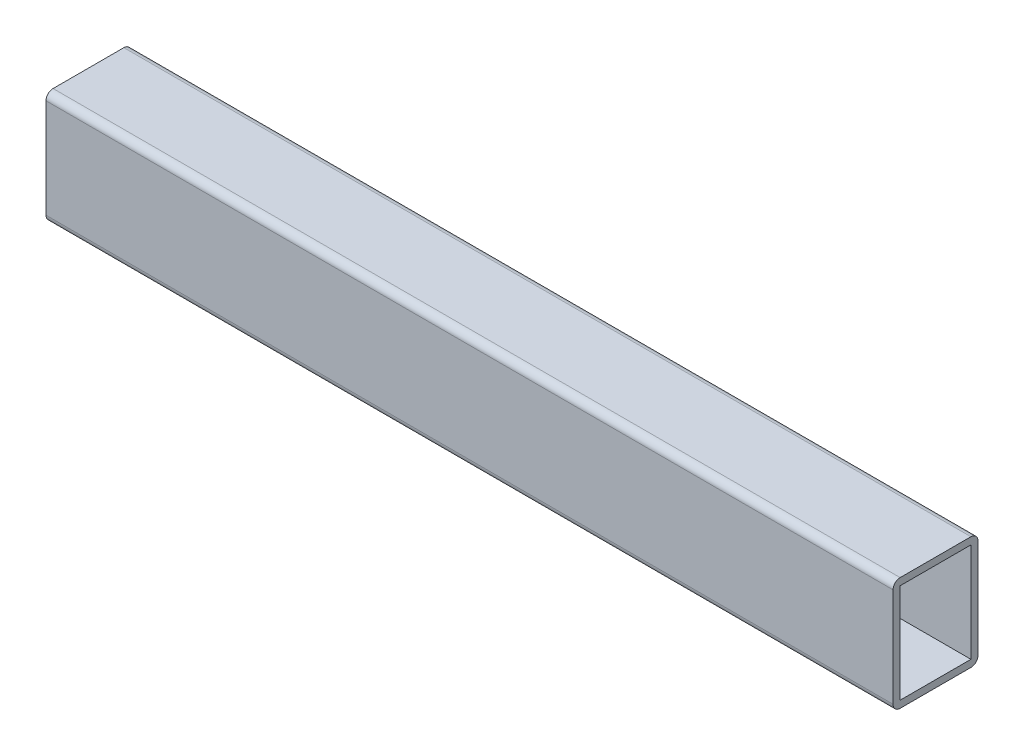
ISO-10303-21;
HEADER;
FILE_DESCRIPTION(('STEP AP214'),'2;1');
FILE_NAME('part.step','',(''),(''),'','','');
FILE_SCHEMA(('AUTOMOTIVE_DESIGN { 1 0 10303 214 1 1 1 1 }'));
ENDSEC;
DATA;
#1=APPLICATION_CONTEXT('core data for automotive mechanical design processes');
#2=APPLICATION_PROTOCOL_DEFINITION('international standard','automotive_design',2000,#1);
#3=PRODUCT_CONTEXT('',#1,'mechanical');
#4=PRODUCT('Part','Part','',(#3));
#5=PRODUCT_RELATED_PRODUCT_CATEGORY('part','',(#4));
#6=PRODUCT_DEFINITION_FORMATION('','',#4);
#7=PRODUCT_DEFINITION_CONTEXT('part definition',#1,'design');
#8=PRODUCT_DEFINITION('design','',#6,#7);
#9=PRODUCT_DEFINITION_SHAPE('','',#8);
#10=(LENGTH_UNIT() NAMED_UNIT(*) SI_UNIT(.MILLI.,.METRE.));
#11=(NAMED_UNIT(*) PLANE_ANGLE_UNIT() SI_UNIT($,.RADIAN.));
#12=(NAMED_UNIT(*) SI_UNIT($,.STERADIAN.) SOLID_ANGLE_UNIT());
#13=UNCERTAINTY_MEASURE_WITH_UNIT(LENGTH_MEASURE(1.E-05),#10,'distance_accuracy_value','');
#14=(GEOMETRIC_REPRESENTATION_CONTEXT(3) GLOBAL_UNCERTAINTY_ASSIGNED_CONTEXT((#13)) GLOBAL_UNIT_ASSIGNED_CONTEXT((#10,
#11,#12)) REPRESENTATION_CONTEXT('',''));
#15=CARTESIAN_POINT('',(0.,0.,0.));
#16=DIRECTION('',(0.,0.,1.));
#17=DIRECTION('',(1.,0.,0.));
#18=AXIS2_PLACEMENT_3D('',#15,#16,#17);
#19=CARTESIAN_POINT('',(380.,22.225,15.875));
#20=DIRECTION('',(1.,0.,0.));
#21=DIRECTION('',(0.,0.,-1.));
#22=AXIS2_PLACEMENT_3D('',#19,#20,#21);
#23=PLANE('',#22);
#24=CARTESIAN_POINT('',(380.,22.225,15.875));
#25=DIRECTION('',(1.,0.,0.));
#26=DIRECTION('',(0.,0.,-1.));
#27=AXIS2_PLACEMENT_3D('',#24,#25,#26);
#28=CIRCLE('',#27,3.175);
#29=CARTESIAN_POINT('',(380.,25.4,15.875));
#30=VERTEX_POINT('',#29);
#31=CARTESIAN_POINT('',(380.,22.225,19.05));
#32=VERTEX_POINT('',#31);
#33=EDGE_CURVE('E156',#30,#32,#28,.T.);
#34=ORIENTED_EDGE('',*,*,#33,.T.);
#35=DIRECTION('',(0.,-1.,0.));
#36=VECTOR('',#35,1.);
#37=CARTESIAN_POINT('',(380.,22.225,19.05));
#38=LINE('',#37,#36);
#39=CARTESIAN_POINT('',(380.,-22.225,19.05));
#40=VERTEX_POINT('',#39);
#41=EDGE_CURVE('E159',#32,#40,#38,.T.);
#42=ORIENTED_EDGE('',*,*,#41,.T.);
#43=CARTESIAN_POINT('',(380.,-22.225,15.875));
#44=DIRECTION('',(1.,0.,0.));
#45=DIRECTION('',(0.,0.,1.));
#46=AXIS2_PLACEMENT_3D('',#43,#44,#45);
#47=CIRCLE('',#46,3.175);
#48=CARTESIAN_POINT('',(380.,-25.4,15.875));
#49=VERTEX_POINT('',#48);
#50=EDGE_CURVE('E162',#40,#49,#47,.T.);
#51=ORIENTED_EDGE('',*,*,#50,.T.);
#52=DIRECTION('',(0.,0.,-1.));
#53=VECTOR('',#52,1.);
#54=CARTESIAN_POINT('',(380.,-25.4,15.875));
#55=LINE('',#54,#53);
#56=CARTESIAN_POINT('',(380.,-25.4,-15.875));
#57=VERTEX_POINT('',#56);
#58=EDGE_CURVE('E164',#49,#57,#55,.T.);
#59=ORIENTED_EDGE('',*,*,#58,.T.);
#60=CARTESIAN_POINT('',(380.,-22.225,-15.875));
#61=DIRECTION('',(1.,0.,0.));
#62=DIRECTION('',(0.,0.,-1.));
#63=AXIS2_PLACEMENT_3D('',#60,#61,#62);
#64=CIRCLE('',#63,3.175);
#65=CARTESIAN_POINT('',(380.,-22.225,-19.05));
#66=VERTEX_POINT('',#65);
#67=EDGE_CURVE('E166',#57,#66,#64,.T.);
#68=ORIENTED_EDGE('',*,*,#67,.T.);
#69=DIRECTION('',(0.,1.,0.));
#70=VECTOR('',#69,1.);
#71=CARTESIAN_POINT('',(380.,22.225,-19.05));
#72=LINE('',#71,#70);
#73=CARTESIAN_POINT('',(380.,22.225,-19.05));
#74=VERTEX_POINT('',#73);
#75=EDGE_CURVE('E168',#66,#74,#72,.T.);
#76=ORIENTED_EDGE('',*,*,#75,.T.);
#77=CARTESIAN_POINT('',(380.,22.225,-15.875));
#78=DIRECTION('',(1.,0.,0.));
#79=DIRECTION('',(0.,0.,-1.));
#80=AXIS2_PLACEMENT_3D('',#77,#78,#79);
#81=CIRCLE('',#80,3.175);
#82=CARTESIAN_POINT('',(380.,25.4,-15.875));
#83=VERTEX_POINT('',#82);
#84=EDGE_CURVE('E170',#74,#83,#81,.T.);
#85=ORIENTED_EDGE('',*,*,#84,.T.);
#86=DIRECTION('',(0.,0.,1.));
#87=VECTOR('',#86,1.);
#88=CARTESIAN_POINT('',(380.,25.4,15.875));
#89=LINE('',#88,#87);
#90=EDGE_CURVE('E172',#83,#30,#89,.T.);
#91=ORIENTED_EDGE('',*,*,#90,.T.);
#92=EDGE_LOOP('',(#34,#42,#51,#59,#68,#76,#85,#91));
#93=FACE_BOUND('',#92,.T.);
#94=DIRECTION('',(0.,0.,-1.));
#95=VECTOR('',#94,1.);
#96=CARTESIAN_POINT('',(380.,-22.225,15.875));
#97=LINE('',#96,#95);
#98=CARTESIAN_POINT('',(380.,-22.225,15.875));
#99=VERTEX_POINT('',#98);
#100=CARTESIAN_POINT('',(380.,-22.225,-15.875));
#101=VERTEX_POINT('',#100);
#102=EDGE_CURVE('E128',#99,#101,#97,.T.);
#103=ORIENTED_EDGE('',*,*,#102,.F.);
#104=DIRECTION('',(0.,-1.,0.));
#105=VECTOR('',#104,1.);
#106=CARTESIAN_POINT('',(380.,22.225,15.875));
#107=LINE('',#106,#105);
#108=CARTESIAN_POINT('',(380.,22.225,15.875));
#109=VERTEX_POINT('',#108);
#110=EDGE_CURVE('E120',#109,#99,#107,.T.);
#111=ORIENTED_EDGE('',*,*,#110,.F.);
#112=DIRECTION('',(0.,0.,1.));
#113=VECTOR('',#112,1.);
#114=CARTESIAN_POINT('',(380.,22.225,15.875));
#115=LINE('',#114,#113);
#116=CARTESIAN_POINT('',(380.,22.225,-15.875));
#117=VERTEX_POINT('',#116);
#118=EDGE_CURVE('E142',#117,#109,#115,.T.);
#119=ORIENTED_EDGE('',*,*,#118,.F.);
#120=DIRECTION('',(0.,1.,0.));
#121=VECTOR('',#120,1.);
#122=CARTESIAN_POINT('',(380.,22.225,-15.875));
#123=LINE('',#122,#121);
#124=EDGE_CURVE('E140',#101,#117,#123,.T.);
#125=ORIENTED_EDGE('',*,*,#124,.F.);
#126=EDGE_LOOP('',(#103,#111,#119,#125));
#127=FACE_BOUND('',#126,.T.);
#128=ADVANCED_FACE('F31',(#93,#127),#23,.T.);
#129=CARTESIAN_POINT('',(0.,22.225,15.875));
#130=DIRECTION('',(1.,0.,0.));
#131=DIRECTION('',(0.,0.,-1.));
#132=AXIS2_PLACEMENT_3D('',#129,#130,#131);
#133=PLANE('',#132);
#134=CARTESIAN_POINT('',(0.,22.225,15.875));
#135=DIRECTION('',(1.,0.,0.));
#136=DIRECTION('',(0.,0.,-1.));
#137=AXIS2_PLACEMENT_3D('',#134,#135,#136);
#138=CIRCLE('',#137,3.175);
#139=CARTESIAN_POINT('',(0.,25.4,15.875));
#140=VERTEX_POINT('',#139);
#141=CARTESIAN_POINT('',(0.,22.225,19.05));
#142=VERTEX_POINT('',#141);
#143=EDGE_CURVE('E136',#140,#142,#138,.T.);
#144=ORIENTED_EDGE('',*,*,#143,.F.);
#145=DIRECTION('',(0.,0.,1.));
#146=VECTOR('',#145,1.);
#147=CARTESIAN_POINT('',(0.,25.4,15.875));
#148=LINE('',#147,#146);
#149=CARTESIAN_POINT('',(0.,25.4,-15.875));
#150=VERTEX_POINT('',#149);
#151=EDGE_CURVE('E160',#150,#140,#148,.T.);
#152=ORIENTED_EDGE('',*,*,#151,.F.);
#153=CARTESIAN_POINT('',(0.,22.225,-15.875));
#154=DIRECTION('',(1.,0.,0.));
#155=DIRECTION('',(0.,0.,-1.));
#156=AXIS2_PLACEMENT_3D('',#153,#154,#155);
#157=CIRCLE('',#156,3.175);
#158=CARTESIAN_POINT('',(0.,22.225,-19.05));
#159=VERTEX_POINT('',#158);
#160=EDGE_CURVE('E187',#159,#150,#157,.T.);
#161=ORIENTED_EDGE('',*,*,#160,.F.);
#162=DIRECTION('',(0.,1.,0.));
#163=VECTOR('',#162,1.);
#164=CARTESIAN_POINT('',(0.,22.225,-19.05));
#165=LINE('',#164,#163);
#166=CARTESIAN_POINT('',(0.,-22.225,-19.05));
#167=VERTEX_POINT('',#166);
#168=EDGE_CURVE('E185',#167,#159,#165,.T.);
#169=ORIENTED_EDGE('',*,*,#168,.F.);
#170=CARTESIAN_POINT('',(0.,-22.225,-15.875));
#171=DIRECTION('',(1.,0.,0.));
#172=DIRECTION('',(0.,0.,-1.));
#173=AXIS2_PLACEMENT_3D('',#170,#171,#172);
#174=CIRCLE('',#173,3.175);
#175=CARTESIAN_POINT('',(0.,-25.4,-15.875));
#176=VERTEX_POINT('',#175);
#177=EDGE_CURVE('E183',#176,#167,#174,.T.);
#178=ORIENTED_EDGE('',*,*,#177,.F.);
#179=DIRECTION('',(0.,0.,-1.));
#180=VECTOR('',#179,1.);
#181=CARTESIAN_POINT('',(0.,-25.4,15.875));
#182=LINE('',#181,#180);
#183=CARTESIAN_POINT('',(0.,-25.4,15.875));
#184=VERTEX_POINT('',#183);
#185=EDGE_CURVE('E181',#184,#176,#182,.T.);
#186=ORIENTED_EDGE('',*,*,#185,.F.);
#187=CARTESIAN_POINT('',(0.,-22.225,15.875));
#188=DIRECTION('',(1.,0.,0.));
#189=DIRECTION('',(0.,0.,1.));
#190=AXIS2_PLACEMENT_3D('',#187,#188,#189);
#191=CIRCLE('',#190,3.175);
#192=CARTESIAN_POINT('',(0.,-22.225,19.05));
#193=VERTEX_POINT('',#192);
#194=EDGE_CURVE('E179',#193,#184,#191,.T.);
#195=ORIENTED_EDGE('',*,*,#194,.F.);
#196=DIRECTION('',(0.,-1.,0.));
#197=VECTOR('',#196,1.);
#198=CARTESIAN_POINT('',(0.,22.225,19.05));
#199=LINE('',#198,#197);
#200=EDGE_CURVE('E177',#142,#193,#199,.T.);
#201=ORIENTED_EDGE('',*,*,#200,.F.);
#202=EDGE_LOOP('',(#144,#152,#161,#169,#178,#186,#195,#201));
#203=FACE_BOUND('',#202,.T.);
#204=DIRECTION('',(0.,-1.,0.));
#205=VECTOR('',#204,1.);
#206=CARTESIAN_POINT('',(0.,22.225,15.875));
#207=LINE('',#206,#205);
#208=CARTESIAN_POINT('',(0.,22.225,15.875));
#209=VERTEX_POINT('',#208);
#210=CARTESIAN_POINT('',(0.,-22.225,15.875));
#211=VERTEX_POINT('',#210);
#212=EDGE_CURVE('E54',#209,#211,#207,.T.);
#213=ORIENTED_EDGE('',*,*,#212,.T.);
#214=DIRECTION('',(0.,0.,-1.));
#215=VECTOR('',#214,1.);
#216=CARTESIAN_POINT('',(0.,-22.225,15.875));
#217=LINE('',#216,#215);
#218=CARTESIAN_POINT('',(0.,-22.225,-15.875));
#219=VERTEX_POINT('',#218);
#220=EDGE_CURVE('E135',#211,#219,#217,.T.);
#221=ORIENTED_EDGE('',*,*,#220,.T.);
#222=DIRECTION('',(0.,1.,0.));
#223=VECTOR('',#222,1.);
#224=CARTESIAN_POINT('',(0.,22.225,-15.875));
#225=LINE('',#224,#223);
#226=CARTESIAN_POINT('',(0.,22.225,-15.875));
#227=VERTEX_POINT('',#226);
#228=EDGE_CURVE('E148',#219,#227,#225,.T.);
#229=ORIENTED_EDGE('',*,*,#228,.T.);
#230=DIRECTION('',(0.,0.,1.));
#231=VECTOR('',#230,1.);
#232=CARTESIAN_POINT('',(0.,22.225,15.875));
#233=LINE('',#232,#231);
#234=EDGE_CURVE('E129',#227,#209,#233,.T.);
#235=ORIENTED_EDGE('',*,*,#234,.T.);
#236=EDGE_LOOP('',(#213,#221,#229,#235));
#237=FACE_BOUND('',#236,.T.);
#238=ADVANCED_FACE('F217',(#203,#237),#133,.F.);
#239=CARTESIAN_POINT('',(380.,22.225,15.875));
#240=DIRECTION('',(-1.,0.,0.));
#241=DIRECTION('',(0.,0.,1.));
#242=AXIS2_PLACEMENT_3D('',#239,#240,#241);
#243=CYLINDRICAL_SURFACE('',#242,3.175);
#244=ORIENTED_EDGE('',*,*,#143,.T.);
#245=DIRECTION('',(-1.,0.,0.));
#246=VECTOR('',#245,1.);
#247=CARTESIAN_POINT('',(380.,22.225,19.05));
#248=LINE('',#247,#246);
#249=EDGE_CURVE('E11',#32,#142,#248,.T.);
#250=ORIENTED_EDGE('',*,*,#249,.F.);
#251=ORIENTED_EDGE('',*,*,#33,.F.);
#252=DIRECTION('',(-1.,0.,0.));
#253=VECTOR('',#252,1.);
#254=CARTESIAN_POINT('',(380.,25.4,15.875));
#255=LINE('',#254,#253);
#256=EDGE_CURVE('E174',#30,#140,#255,.T.);
#257=ORIENTED_EDGE('',*,*,#256,.T.);
#258=EDGE_LOOP('',(#244,#250,#251,#257));
#259=FACE_BOUND('',#258,.T.);
#260=ADVANCED_FACE('F33',(#259),#243,.T.);
#261=CARTESIAN_POINT('',(380.,22.225,19.05));
#262=DIRECTION('',(0.,0.,-1.));
#263=DIRECTION('',(-1.,0.,0.));
#264=AXIS2_PLACEMENT_3D('',#261,#262,#263);
#265=PLANE('',#264);
#266=ORIENTED_EDGE('',*,*,#200,.T.);
#267=DIRECTION('',(-1.,0.,0.));
#268=VECTOR('',#267,1.);
#269=CARTESIAN_POINT('',(380.,-22.225,19.05));
#270=LINE('',#269,#268);
#271=EDGE_CURVE('E39',#40,#193,#270,.T.);
#272=ORIENTED_EDGE('',*,*,#271,.F.);
#273=ORIENTED_EDGE('',*,*,#41,.F.);
#274=ORIENTED_EDGE('',*,*,#249,.T.);
#275=EDGE_LOOP('',(#266,#272,#273,#274));
#276=FACE_BOUND('',#275,.T.);
#277=ADVANCED_FACE('F234',(#276),#265,.F.);
#278=CARTESIAN_POINT('',(380.,-22.225,15.875));
#279=DIRECTION('',(-1.,0.,0.));
#280=DIRECTION('',(0.,0.,1.));
#281=AXIS2_PLACEMENT_3D('',#278,#279,#280);
#282=CYLINDRICAL_SURFACE('',#281,3.175);
#283=ORIENTED_EDGE('',*,*,#194,.T.);
#284=DIRECTION('',(-1.,0.,0.));
#285=VECTOR('',#284,1.);
#286=CARTESIAN_POINT('',(380.,-25.4,15.875));
#287=LINE('',#286,#285);
#288=EDGE_CURVE('E204',#49,#184,#287,.T.);
#289=ORIENTED_EDGE('',*,*,#288,.F.);
#290=ORIENTED_EDGE('',*,*,#50,.F.);
#291=ORIENTED_EDGE('',*,*,#271,.T.);
#292=EDGE_LOOP('',(#283,#289,#290,#291));
#293=FACE_BOUND('',#292,.T.);
#294=ADVANCED_FACE('F211',(#293),#282,.T.);
#295=CARTESIAN_POINT('',(380.,-25.4,15.875));
#296=DIRECTION('',(0.,1.,0.));
#297=DIRECTION('',(0.,0.,1.));
#298=AXIS2_PLACEMENT_3D('',#295,#296,#297);
#299=PLANE('',#298);
#300=ORIENTED_EDGE('',*,*,#185,.T.);
#301=DIRECTION('',(-1.,0.,0.));
#302=VECTOR('',#301,1.);
#303=CARTESIAN_POINT('',(380.,-25.4,-15.875));
#304=LINE('',#303,#302);
#305=EDGE_CURVE('E201',#57,#176,#304,.T.);
#306=ORIENTED_EDGE('',*,*,#305,.F.);
#307=ORIENTED_EDGE('',*,*,#58,.F.);
#308=ORIENTED_EDGE('',*,*,#288,.T.);
#309=EDGE_LOOP('',(#300,#306,#307,#308));
#310=FACE_BOUND('',#309,.T.);
#311=ADVANCED_FACE('F223',(#310),#299,.F.);
#312=CARTESIAN_POINT('',(380.,-22.225,-15.875));
#313=DIRECTION('',(-1.,0.,0.));
#314=DIRECTION('',(0.,0.,1.));
#315=AXIS2_PLACEMENT_3D('',#312,#313,#314);
#316=CYLINDRICAL_SURFACE('',#315,3.175);
#317=ORIENTED_EDGE('',*,*,#177,.T.);
#318=DIRECTION('',(-1.,0.,0.));
#319=VECTOR('',#318,1.);
#320=CARTESIAN_POINT('',(380.,-22.225,-19.05));
#321=LINE('',#320,#319);
#322=EDGE_CURVE('E198',#66,#167,#321,.T.);
#323=ORIENTED_EDGE('',*,*,#322,.F.);
#324=ORIENTED_EDGE('',*,*,#67,.F.);
#325=ORIENTED_EDGE('',*,*,#305,.T.);
#326=EDGE_LOOP('',(#317,#323,#324,#325));
#327=FACE_BOUND('',#326,.T.);
#328=ADVANCED_FACE('F227',(#327),#316,.T.);
#329=CARTESIAN_POINT('',(380.,22.225,-19.05));
#330=DIRECTION('',(0.,0.,1.));
#331=DIRECTION('',(1.,0.,0.));
#332=AXIS2_PLACEMENT_3D('',#329,#330,#331);
#333=PLANE('',#332);
#334=ORIENTED_EDGE('',*,*,#168,.T.);
#335=DIRECTION('',(-1.,0.,0.));
#336=VECTOR('',#335,1.);
#337=CARTESIAN_POINT('',(380.,22.225,-19.05));
#338=LINE('',#337,#336);
#339=EDGE_CURVE('E195',#74,#159,#338,.T.);
#340=ORIENTED_EDGE('',*,*,#339,.F.);
#341=ORIENTED_EDGE('',*,*,#75,.F.);
#342=ORIENTED_EDGE('',*,*,#322,.T.);
#343=EDGE_LOOP('',(#334,#340,#341,#342));
#344=FACE_BOUND('',#343,.T.);
#345=ADVANCED_FACE('F247',(#344),#333,.F.);
#346=CARTESIAN_POINT('',(380.,22.225,-15.875));
#347=DIRECTION('',(-1.,0.,0.));
#348=DIRECTION('',(0.,0.,1.));
#349=AXIS2_PLACEMENT_3D('',#346,#347,#348);
#350=CYLINDRICAL_SURFACE('',#349,3.175);
#351=ORIENTED_EDGE('',*,*,#160,.T.);
#352=DIRECTION('',(-1.,0.,0.));
#353=VECTOR('',#352,1.);
#354=CARTESIAN_POINT('',(380.,25.4,-15.875));
#355=LINE('',#354,#353);
#356=EDGE_CURVE('E192',#83,#150,#355,.T.);
#357=ORIENTED_EDGE('',*,*,#356,.F.);
#358=ORIENTED_EDGE('',*,*,#84,.F.);
#359=ORIENTED_EDGE('',*,*,#339,.T.);
#360=EDGE_LOOP('',(#351,#357,#358,#359));
#361=FACE_BOUND('',#360,.T.);
#362=ADVANCED_FACE('F245',(#361),#350,.T.);
#363=CARTESIAN_POINT('',(380.,25.4,15.875));
#364=DIRECTION('',(0.,-1.,0.));
#365=DIRECTION('',(0.,0.,-1.));
#366=AXIS2_PLACEMENT_3D('',#363,#364,#365);
#367=PLANE('',#366);
#368=ORIENTED_EDGE('',*,*,#151,.T.);
#369=ORIENTED_EDGE('',*,*,#256,.F.);
#370=ORIENTED_EDGE('',*,*,#90,.F.);
#371=ORIENTED_EDGE('',*,*,#356,.T.);
#372=EDGE_LOOP('',(#368,#369,#370,#371));
#373=FACE_BOUND('',#372,.T.);
#374=ADVANCED_FACE('F240',(#373),#367,.F.);
#375=CARTESIAN_POINT('',(380.,22.225,15.875));
#376=DIRECTION('',(0.,0.,-1.));
#377=DIRECTION('',(-1.,0.,0.));
#378=AXIS2_PLACEMENT_3D('',#375,#376,#377);
#379=PLANE('',#378);
#380=ORIENTED_EDGE('',*,*,#212,.F.);
#381=DIRECTION('',(-1.,0.,0.));
#382=VECTOR('',#381,1.);
#383=CARTESIAN_POINT('',(380.,22.225,15.875));
#384=LINE('',#383,#382);
#385=EDGE_CURVE('E124',#109,#209,#384,.T.);
#386=ORIENTED_EDGE('',*,*,#385,.F.);
#387=ORIENTED_EDGE('',*,*,#110,.T.);
#388=DIRECTION('',(-1.,0.,0.));
#389=VECTOR('',#388,1.);
#390=CARTESIAN_POINT('',(380.,-22.225,15.875));
#391=LINE('',#390,#389);
#392=EDGE_CURVE('E123',#99,#211,#391,.T.);
#393=ORIENTED_EDGE('',*,*,#392,.T.);
#394=EDGE_LOOP('',(#380,#386,#387,#393));
#395=FACE_BOUND('',#394,.T.);
#396=ADVANCED_FACE('F122',(#395),#379,.T.);
#397=CARTESIAN_POINT('',(380.,-22.225,15.875));
#398=DIRECTION('',(0.,1.,0.));
#399=DIRECTION('',(0.,0.,1.));
#400=AXIS2_PLACEMENT_3D('',#397,#398,#399);
#401=PLANE('',#400);
#402=ORIENTED_EDGE('',*,*,#220,.F.);
#403=ORIENTED_EDGE('',*,*,#392,.F.);
#404=ORIENTED_EDGE('',*,*,#102,.T.);
#405=DIRECTION('',(-1.,0.,0.));
#406=VECTOR('',#405,1.);
#407=CARTESIAN_POINT('',(380.,-22.225,-15.875));
#408=LINE('',#407,#406);
#409=EDGE_CURVE('E137',#101,#219,#408,.T.);
#410=ORIENTED_EDGE('',*,*,#409,.T.);
#411=EDGE_LOOP('',(#402,#403,#404,#410));
#412=FACE_BOUND('',#411,.T.);
#413=ADVANCED_FACE('F132',(#412),#401,.T.);
#414=CARTESIAN_POINT('',(380.,22.225,-15.875));
#415=DIRECTION('',(0.,0.,1.));
#416=DIRECTION('',(0.,-1.,0.));
#417=AXIS2_PLACEMENT_3D('',#414,#415,#416);
#418=PLANE('',#417);
#419=ORIENTED_EDGE('',*,*,#228,.F.);
#420=ORIENTED_EDGE('',*,*,#409,.F.);
#421=ORIENTED_EDGE('',*,*,#124,.T.);
#422=DIRECTION('',(-1.,0.,0.));
#423=VECTOR('',#422,1.);
#424=CARTESIAN_POINT('',(380.,22.225,-15.875));
#425=LINE('',#424,#423);
#426=EDGE_CURVE('E46',#117,#227,#425,.T.);
#427=ORIENTED_EDGE('',*,*,#426,.T.);
#428=EDGE_LOOP('',(#419,#420,#421,#427));
#429=FACE_BOUND('',#428,.T.);
#430=ADVANCED_FACE('F272',(#429),#418,.T.);
#431=CARTESIAN_POINT('',(380.,22.225,15.875));
#432=DIRECTION('',(0.,-1.,0.));
#433=DIRECTION('',(0.,0.,-1.));
#434=AXIS2_PLACEMENT_3D('',#431,#432,#433);
#435=PLANE('',#434);
#436=ORIENTED_EDGE('',*,*,#234,.F.);
#437=ORIENTED_EDGE('',*,*,#426,.F.);
#438=ORIENTED_EDGE('',*,*,#118,.T.);
#439=ORIENTED_EDGE('',*,*,#385,.T.);
#440=EDGE_LOOP('',(#436,#437,#438,#439));
#441=FACE_BOUND('',#440,.T.);
#442=ADVANCED_FACE('F276',(#441),#435,.T.);
#443=CLOSED_SHELL('',(#128,#238,#260,#277,#294,#311,#328,#345,#362,#374,#396,#413,#430,#442));
#444=MANIFOLD_SOLID_BREP('B2',#443);
#445=ADVANCED_BREP_SHAPE_REPRESENTATION('',(#18,#444),#14);
#446=SHAPE_DEFINITION_REPRESENTATION(#9,#445);
ENDSEC;
END-ISO-10303-21;
